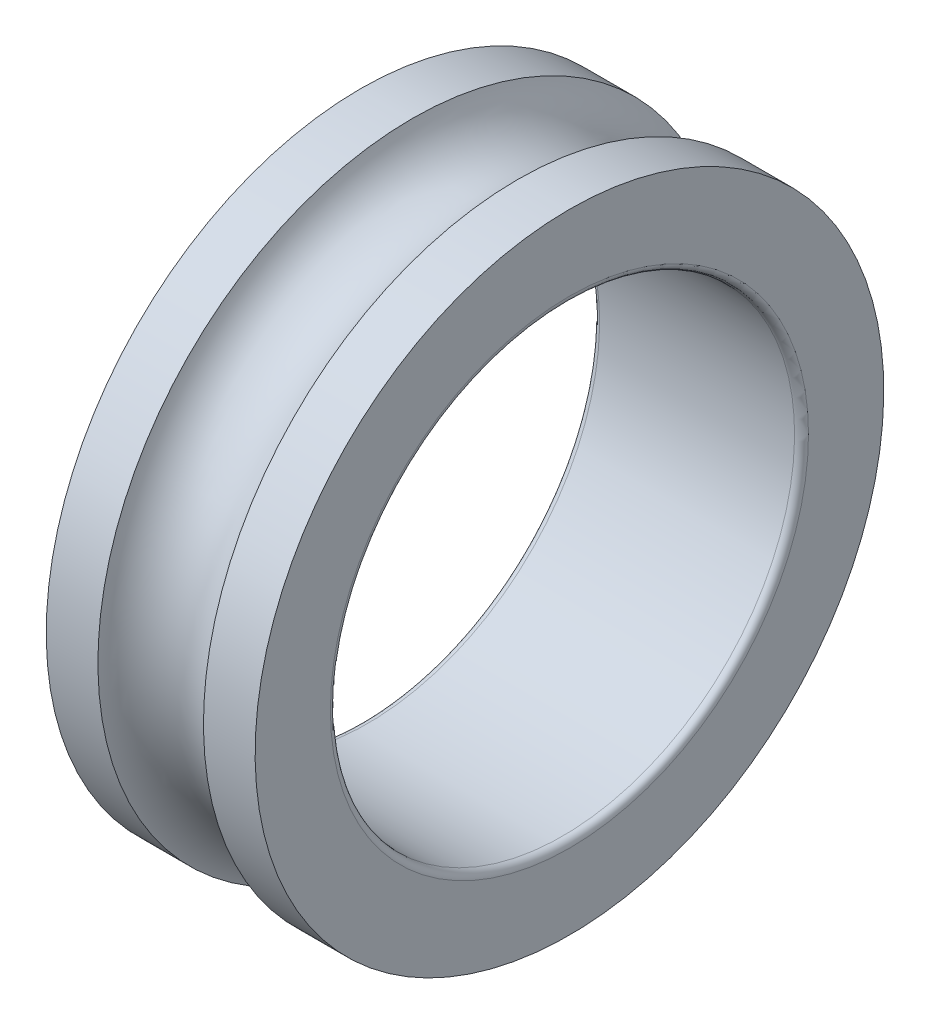
ISO-10303-21;
HEADER;
FILE_DESCRIPTION(('STEP AP214'),'2;1');
FILE_NAME('part.step','',(''),(''),'','','');
FILE_SCHEMA(('AUTOMOTIVE_DESIGN { 1 0 10303 214 1 1 1 1 }'));
ENDSEC;
DATA;
#1=APPLICATION_CONTEXT('core data for automotive mechanical design processes');
#2=APPLICATION_PROTOCOL_DEFINITION('international standard','automotive_design',2000,#1);
#3=PRODUCT_CONTEXT('',#1,'mechanical');
#4=PRODUCT('Part','Part','',(#3));
#5=PRODUCT_RELATED_PRODUCT_CATEGORY('part','',(#4));
#6=PRODUCT_DEFINITION_FORMATION('','',#4);
#7=PRODUCT_DEFINITION_CONTEXT('part definition',#1,'design');
#8=PRODUCT_DEFINITION('design','',#6,#7);
#9=PRODUCT_DEFINITION_SHAPE('','',#8);
#10=(LENGTH_UNIT() NAMED_UNIT(*) SI_UNIT(.MILLI.,.METRE.));
#11=(NAMED_UNIT(*) PLANE_ANGLE_UNIT() SI_UNIT($,.RADIAN.));
#12=(NAMED_UNIT(*) SI_UNIT($,.STERADIAN.) SOLID_ANGLE_UNIT());
#13=UNCERTAINTY_MEASURE_WITH_UNIT(LENGTH_MEASURE(1.E-05),#10,'distance_accuracy_value','');
#14=(GEOMETRIC_REPRESENTATION_CONTEXT(3) GLOBAL_UNCERTAINTY_ASSIGNED_CONTEXT((#13)) GLOBAL_UNIT_ASSIGNED_CONTEXT((#10,
#11,#12)) REPRESENTATION_CONTEXT('',''));
#15=CARTESIAN_POINT('',(0.,0.,0.));
#16=DIRECTION('',(0.,0.,1.));
#17=DIRECTION('',(1.,0.,0.));
#18=AXIS2_PLACEMENT_3D('',#15,#16,#17);
#19=CARTESIAN_POINT('',(7.88676717465583,0.,0.));
#20=DIRECTION('',(-1.,0.,0.));
#21=DIRECTION('',(0.,1.,0.));
#22=AXIS2_PLACEMENT_3D('',#19,#20,#21);
#23=CYLINDRICAL_SURFACE('',#22,13.54275);
#24=CARTESIAN_POINT('',(6.77353434931166,0.,0.));
#25=DIRECTION('',(1.,0.,0.));
#26=DIRECTION('',(0.,1.,0.));
#27=AXIS2_PLACEMENT_3D('',#24,#25,#26);
#28=CIRCLE('',#27,13.54275);
#29=CARTESIAN_POINT('',(6.77353434931166,13.54275,0.));
#30=VERTEX_POINT('',#29);
#31=EDGE_CURVE('E11',#30,#30,#28,.T.);
#32=ORIENTED_EDGE('',*,*,#31,.T.);
#33=EDGE_LOOP('',(#32));
#34=FACE_BOUND('',#33,.T.);
#35=CARTESIAN_POINT('',(9.,0.,0.));
#36=DIRECTION('',(1.,0.,0.));
#37=DIRECTION('',(0.,1.,0.));
#38=AXIS2_PLACEMENT_3D('',#35,#36,#37);
#39=CIRCLE('',#38,13.54275);
#40=CARTESIAN_POINT('',(9.,13.54275,0.));
#41=VERTEX_POINT('',#40);
#42=EDGE_CURVE('E59',#41,#41,#39,.T.);
#43=ORIENTED_EDGE('',*,*,#42,.F.);
#44=EDGE_LOOP('',(#43));
#45=FACE_BOUND('',#44,.T.);
#46=ADVANCED_FACE('F16',(#34,#45),#23,.T.);
#47=CARTESIAN_POINT('',(4.5,0.,0.));
#48=DIRECTION('',(1.,0.,0.));
#49=DIRECTION('',(0.,0.,-1.));
#50=AXIS2_PLACEMENT_3D('',#47,#48,#49);
#51=TOROIDAL_SURFACE('',#50,14.25,2.381);
#52=CARTESIAN_POINT('',(2.22646565068834,0.,0.));
#53=DIRECTION('',(1.,0.,0.));
#54=DIRECTION('',(0.,1.,0.));
#55=AXIS2_PLACEMENT_3D('',#52,#53,#54);
#56=CIRCLE('',#55,13.54275);
#57=CARTESIAN_POINT('',(2.22646565068834,13.54275,0.));
#58=VERTEX_POINT('',#57);
#59=EDGE_CURVE('E20',#58,#58,#56,.T.);
#60=ORIENTED_EDGE('',*,*,#59,.T.);
#61=EDGE_LOOP('',(#60));
#62=FACE_BOUND('',#61,.T.);
#63=ORIENTED_EDGE('',*,*,#31,.F.);
#64=EDGE_LOOP('',(#63));
#65=FACE_BOUND('',#64,.T.);
#66=ADVANCED_FACE('F70',(#62,#65),#51,.F.);
#67=CARTESIAN_POINT('',(1.11323282534417,0.,0.));
#68=DIRECTION('',(-1.,0.,0.));
#69=DIRECTION('',(0.,1.,0.));
#70=AXIS2_PLACEMENT_3D('',#67,#68,#69);
#71=CYLINDRICAL_SURFACE('',#70,13.54275);
#72=CARTESIAN_POINT('',(0.,0.,0.));
#73=DIRECTION('',(1.,0.,0.));
#74=DIRECTION('',(0.,1.,0.));
#75=AXIS2_PLACEMENT_3D('',#72,#73,#74);
#76=CIRCLE('',#75,13.54275);
#77=CARTESIAN_POINT('',(0.,13.54275,0.));
#78=VERTEX_POINT('',#77);
#79=EDGE_CURVE('E48',#78,#78,#76,.T.);
#80=ORIENTED_EDGE('',*,*,#79,.T.);
#81=EDGE_LOOP('',(#80));
#82=FACE_BOUND('',#81,.T.);
#83=ORIENTED_EDGE('',*,*,#59,.F.);
#84=EDGE_LOOP('',(#83));
#85=FACE_BOUND('',#84,.T.);
#86=ADVANCED_FACE('F49',(#82,#85),#71,.T.);
#87=CARTESIAN_POINT('',(0.,11.921375,0.));
#88=DIRECTION('',(-1.,0.,0.));
#89=DIRECTION('',(0.,-1.,0.));
#90=AXIS2_PLACEMENT_3D('',#87,#88,#89);
#91=PLANE('',#90);
#92=CARTESIAN_POINT('',(0.,0.,0.));
#93=DIRECTION('',(1.,0.,0.));
#94=DIRECTION('',(0.,1.,0.));
#95=AXIS2_PLACEMENT_3D('',#92,#93,#94);
#96=CIRCLE('',#95,10.3);
#97=CARTESIAN_POINT('',(0.,10.3,0.));
#98=VERTEX_POINT('',#97);
#99=EDGE_CURVE('E52',#98,#98,#96,.T.);
#100=ORIENTED_EDGE('',*,*,#99,.T.);
#101=EDGE_LOOP('',(#100));
#102=FACE_BOUND('',#101,.T.);
#103=ORIENTED_EDGE('',*,*,#79,.F.);
#104=EDGE_LOOP('',(#103));
#105=FACE_BOUND('',#104,.T.);
#106=ADVANCED_FACE('F18',(#102,#105),#91,.T.);
#107=CARTESIAN_POINT('',(0.3,0.,0.));
#108=DIRECTION('',(1.,0.,0.));
#109=DIRECTION('',(0.,0.,-1.));
#110=AXIS2_PLACEMENT_3D('',#107,#108,#109);
#111=TOROIDAL_SURFACE('',#110,10.3,0.3);
#112=CARTESIAN_POINT('',(0.3,0.,0.));
#113=DIRECTION('',(1.,0.,0.));
#114=DIRECTION('',(0.,1.,0.));
#115=AXIS2_PLACEMENT_3D('',#112,#113,#114);
#116=CIRCLE('',#115,10.);
#117=CARTESIAN_POINT('',(0.3,10.,0.));
#118=VERTEX_POINT('',#117);
#119=EDGE_CURVE('E53',#118,#118,#116,.T.);
#120=ORIENTED_EDGE('',*,*,#119,.T.);
#121=EDGE_LOOP('',(#120));
#122=FACE_BOUND('',#121,.T.);
#123=ORIENTED_EDGE('',*,*,#99,.F.);
#124=EDGE_LOOP('',(#123));
#125=FACE_BOUND('',#124,.T.);
#126=ADVANCED_FACE('F82',(#122,#125),#111,.T.);
#127=CARTESIAN_POINT('',(4.5,0.,0.));
#128=DIRECTION('',(-1.,0.,0.));
#129=DIRECTION('',(0.,1.,0.));
#130=AXIS2_PLACEMENT_3D('',#127,#128,#129);
#131=CYLINDRICAL_SURFACE('',#130,10.);
#132=CARTESIAN_POINT('',(8.7,0.,0.));
#133=DIRECTION('',(1.,0.,0.));
#134=DIRECTION('',(0.,1.,0.));
#135=AXIS2_PLACEMENT_3D('',#132,#133,#134);
#136=CIRCLE('',#135,10.);
#137=CARTESIAN_POINT('',(8.7,10.,0.));
#138=VERTEX_POINT('',#137);
#139=EDGE_CURVE('E56',#138,#138,#136,.T.);
#140=ORIENTED_EDGE('',*,*,#139,.T.);
#141=EDGE_LOOP('',(#140));
#142=FACE_BOUND('',#141,.T.);
#143=ORIENTED_EDGE('',*,*,#119,.F.);
#144=EDGE_LOOP('',(#143));
#145=FACE_BOUND('',#144,.T.);
#146=ADVANCED_FACE('F79',(#142,#145),#131,.F.);
#147=CARTESIAN_POINT('',(8.7,0.,0.));
#148=DIRECTION('',(1.,0.,0.));
#149=DIRECTION('',(0.,0.,-1.));
#150=AXIS2_PLACEMENT_3D('',#147,#148,#149);
#151=TOROIDAL_SURFACE('',#150,10.3,0.3);
#152=CARTESIAN_POINT('',(9.,0.,0.));
#153=DIRECTION('',(1.,0.,0.));
#154=DIRECTION('',(0.,1.,0.));
#155=AXIS2_PLACEMENT_3D('',#152,#153,#154);
#156=CIRCLE('',#155,10.3);
#157=CARTESIAN_POINT('',(9.,10.3,0.));
#158=VERTEX_POINT('',#157);
#159=EDGE_CURVE('E62',#158,#158,#156,.T.);
#160=ORIENTED_EDGE('',*,*,#159,.T.);
#161=EDGE_LOOP('',(#160));
#162=FACE_BOUND('',#161,.T.);
#163=ORIENTED_EDGE('',*,*,#139,.F.);
#164=EDGE_LOOP('',(#163));
#165=FACE_BOUND('',#164,.T.);
#166=ADVANCED_FACE('F81',(#162,#165),#151,.T.);
#167=CARTESIAN_POINT('',(9.,11.921375,0.));
#168=DIRECTION('',(1.,0.,0.));
#169=DIRECTION('',(0.,1.,0.));
#170=AXIS2_PLACEMENT_3D('',#167,#168,#169);
#171=PLANE('',#170);
#172=ORIENTED_EDGE('',*,*,#42,.T.);
#173=EDGE_LOOP('',(#172));
#174=FACE_BOUND('',#173,.T.);
#175=ORIENTED_EDGE('',*,*,#159,.F.);
#176=EDGE_LOOP('',(#175));
#177=FACE_BOUND('',#176,.T.);
#178=ADVANCED_FACE('F66',(#174,#177),#171,.T.);
#179=CLOSED_SHELL('',(#46,#66,#86,#106,#126,#146,#166,#178));
#180=MANIFOLD_SOLID_BREP('B1',#179);
#181=ADVANCED_BREP_SHAPE_REPRESENTATION('',(#18,#180),#14);
#182=SHAPE_DEFINITION_REPRESENTATION(#9,#181);
ENDSEC;
END-ISO-10303-21;
